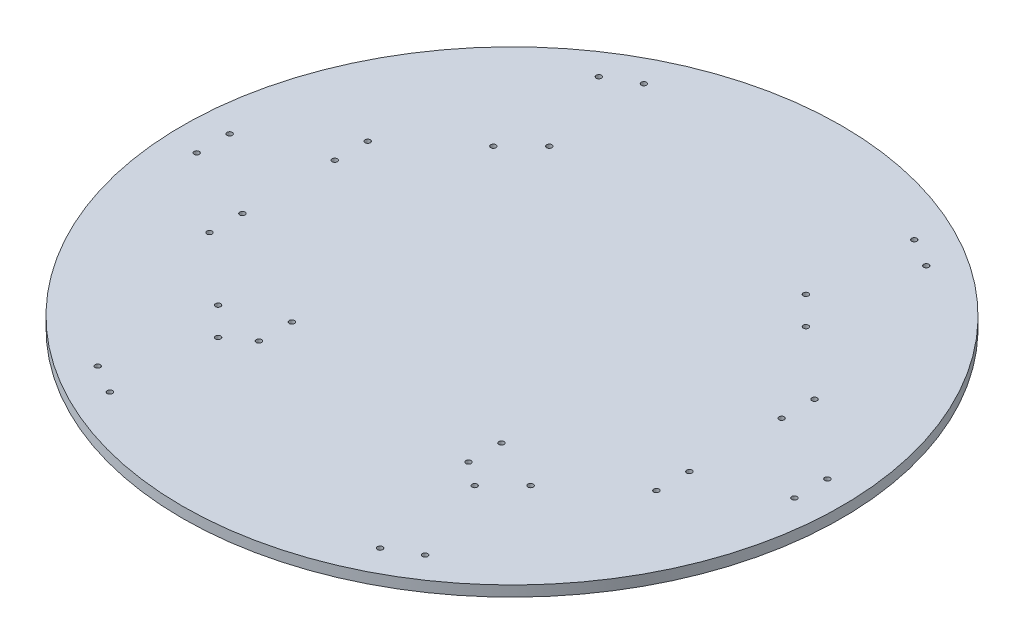
ISO-10303-21;
HEADER;
FILE_DESCRIPTION(('STEP AP214'),'2;1');
FILE_NAME('part.step','',(''),(''),'','','');
FILE_SCHEMA(('AUTOMOTIVE_DESIGN { 1 0 10303 214 1 1 1 1 }'));
ENDSEC;
DATA;
#1=APPLICATION_CONTEXT('core data for automotive mechanical design processes');
#2=APPLICATION_PROTOCOL_DEFINITION('international standard','automotive_design',2000,#1);
#3=PRODUCT_CONTEXT('',#1,'mechanical');
#4=PRODUCT('Part','Part','',(#3));
#5=PRODUCT_RELATED_PRODUCT_CATEGORY('part','',(#4));
#6=PRODUCT_DEFINITION_FORMATION('','',#4);
#7=PRODUCT_DEFINITION_CONTEXT('part definition',#1,'design');
#8=PRODUCT_DEFINITION('design','',#6,#7);
#9=PRODUCT_DEFINITION_SHAPE('','',#8);
#10=(LENGTH_UNIT() NAMED_UNIT(*) SI_UNIT(.MILLI.,.METRE.));
#11=(NAMED_UNIT(*) PLANE_ANGLE_UNIT() SI_UNIT($,.RADIAN.));
#12=(NAMED_UNIT(*) SI_UNIT($,.STERADIAN.) SOLID_ANGLE_UNIT());
#13=UNCERTAINTY_MEASURE_WITH_UNIT(LENGTH_MEASURE(1.E-05),#10,'distance_accuracy_value','');
#14=(GEOMETRIC_REPRESENTATION_CONTEXT(3) GLOBAL_UNCERTAINTY_ASSIGNED_CONTEXT((#13)) GLOBAL_UNIT_ASSIGNED_CONTEXT((#10,
#11,#12)) REPRESENTATION_CONTEXT('',''));
#15=CARTESIAN_POINT('',(0.,0.,0.));
#16=DIRECTION('',(0.,0.,1.));
#17=DIRECTION('',(1.,0.,0.));
#18=AXIS2_PLACEMENT_3D('',#15,#16,#17);
#19=CARTESIAN_POINT('',(0.,8.,0.));
#20=DIRECTION('',(0.,-1.,0.));
#21=DIRECTION('',(0.,0.,-1.));
#22=AXIS2_PLACEMENT_3D('',#19,#20,#21);
#23=CYLINDRICAL_SURFACE('',#22,250.);
#24=CARTESIAN_POINT('',(0.,8.,0.));
#25=DIRECTION('',(0.,1.,0.));
#26=DIRECTION('',(0.,0.,1.));
#27=AXIS2_PLACEMENT_3D('',#24,#25,#26);
#28=CIRCLE('',#27,250.);
#29=CARTESIAN_POINT('',(0.,8.,250.));
#30=VERTEX_POINT('',#29);
#31=EDGE_CURVE('E10',#30,#30,#28,.T.);
#32=ORIENTED_EDGE('',*,*,#31,.F.);
#33=EDGE_LOOP('',(#32));
#34=FACE_BOUND('',#33,.T.);
#35=CARTESIAN_POINT('',(0.,0.,0.));
#36=DIRECTION('',(0.,1.,0.));
#37=DIRECTION('',(0.,0.,1.));
#38=AXIS2_PLACEMENT_3D('',#35,#36,#37);
#39=CIRCLE('',#38,250.);
#40=CARTESIAN_POINT('',(0.,0.,250.));
#41=VERTEX_POINT('',#40);
#42=EDGE_CURVE('E38',#41,#41,#39,.T.);
#43=ORIENTED_EDGE('',*,*,#42,.T.);
#44=EDGE_LOOP('',(#43));
#45=FACE_BOUND('',#44,.T.);
#46=ADVANCED_FACE('F35',(#34,#45),#23,.T.);
#47=CARTESIAN_POINT('',(0.,8.,0.));
#48=DIRECTION('',(0.,1.,0.));
#49=DIRECTION('',(0.,0.,1.));
#50=AXIS2_PLACEMENT_3D('',#47,#48,#49);
#51=PLANE('',#50);
#52=CARTESIAN_POINT('',(79.5,8.,87.5));
#53=DIRECTION('',(0.,1.,0.));
#54=DIRECTION('',(0.,0.,-1.));
#55=AXIS2_PLACEMENT_3D('',#52,#53,#54);
#56=CIRCLE('',#55,2.);
#57=CARTESIAN_POINT('',(79.5,8.,85.5));
#58=VERTEX_POINT('',#57);
#59=EDGE_CURVE('E230',#58,#58,#56,.T.);
#60=ORIENTED_EDGE('',*,*,#59,.F.);
#61=EDGE_LOOP('',(#60));
#62=FACE_BOUND('',#61,.T.);
#63=CARTESIAN_POINT('',(79.5,8.,112.5));
#64=DIRECTION('',(0.,1.,0.));
#65=DIRECTION('',(0.,0.,-1.));
#66=AXIS2_PLACEMENT_3D('',#63,#64,#65);
#67=CIRCLE('',#66,2.);
#68=CARTESIAN_POINT('',(79.5,8.,110.5));
#69=VERTEX_POINT('',#68);
#70=EDGE_CURVE('E224',#69,#69,#67,.T.);
#71=ORIENTED_EDGE('',*,*,#70,.F.);
#72=EDGE_LOOP('',(#71));
#73=FACE_BOUND('',#72,.T.);
#74=CARTESIAN_POINT('',(-169.500000000015,8.,-35.000000000001));
#75=DIRECTION('',(0.,1.,0.));
#76=DIRECTION('',(0.,0.,-1.));
#77=AXIS2_PLACEMENT_3D('',#74,#75,#76);
#78=CIRCLE('',#77,2.);
#79=CARTESIAN_POINT('',(-169.500000000015,8.,-37.000000000001));
#80=VERTEX_POINT('',#79);
#81=EDGE_CURVE('E221',#80,#80,#78,.T.);
#82=ORIENTED_EDGE('',*,*,#81,.F.);
#83=EDGE_LOOP('',(#82));
#84=FACE_BOUND('',#83,.T.);
#85=CARTESIAN_POINT('',(-169.500000000015,8.,-60.000000000001));
#86=DIRECTION('',(0.,1.,0.));
#87=DIRECTION('',(0.,0.,-1.));
#88=AXIS2_PLACEMENT_3D('',#85,#86,#87);
#89=CIRCLE('',#88,2.);
#90=CARTESIAN_POINT('',(-169.500000000015,8.,-62.000000000001));
#91=VERTEX_POINT('',#90);
#92=EDGE_CURVE('E215',#91,#91,#89,.T.);
#93=ORIENTED_EDGE('',*,*,#92,.F.);
#94=EDGE_LOOP('',(#93));
#95=FACE_BOUND('',#94,.T.);
#96=CARTESIAN_POINT('',(-169.500000000015,8.,35.000000000001));
#97=DIRECTION('',(0.,-1.,0.));
#98=DIRECTION('',(0.,0.,1.));
#99=AXIS2_PLACEMENT_3D('',#96,#97,#98);
#100=CIRCLE('',#99,2.);
#101=CARTESIAN_POINT('',(-169.500000000015,8.,37.000000000001));
#102=VERTEX_POINT('',#101);
#103=EDGE_CURVE('E209',#102,#102,#100,.T.);
#104=ORIENTED_EDGE('',*,*,#103,.T.);
#105=EDGE_LOOP('',(#104));
#106=FACE_BOUND('',#105,.T.);
#107=CARTESIAN_POINT('',(-169.500000000015,8.,60.000000000001));
#108=DIRECTION('',(0.,-1.,0.));
#109=DIRECTION('',(0.,0.,1.));
#110=AXIS2_PLACEMENT_3D('',#107,#108,#109);
#111=CIRCLE('',#110,2.);
#112=CARTESIAN_POINT('',(-169.500000000015,8.,62.000000000001));
#113=VERTEX_POINT('',#112);
#114=EDGE_CURVE('E203',#113,#113,#111,.T.);
#115=ORIENTED_EDGE('',*,*,#114,.T.);
#116=EDGE_LOOP('',(#115));
#117=FACE_BOUND('',#116,.T.);
#118=CARTESIAN_POINT('',(169.500000000015,8.,-35.000000000001));
#119=DIRECTION('',(0.,-1.,0.));
#120=DIRECTION('',(0.,0.,-1.));
#121=AXIS2_PLACEMENT_3D('',#118,#119,#120);
#122=CIRCLE('',#121,2.);
#123=CARTESIAN_POINT('',(169.500000000015,8.,-37.000000000001));
#124=VERTEX_POINT('',#123);
#125=EDGE_CURVE('E197',#124,#124,#122,.T.);
#126=ORIENTED_EDGE('',*,*,#125,.T.);
#127=EDGE_LOOP('',(#126));
#128=FACE_BOUND('',#127,.T.);
#129=CARTESIAN_POINT('',(169.500000000015,8.,-60.000000000001));
#130=DIRECTION('',(0.,-1.,0.));
#131=DIRECTION('',(0.,0.,-1.));
#132=AXIS2_PLACEMENT_3D('',#129,#130,#131);
#133=CIRCLE('',#132,2.);
#134=CARTESIAN_POINT('',(169.500000000015,8.,-62.000000000001));
#135=VERTEX_POINT('',#134);
#136=EDGE_CURVE('E191',#135,#135,#133,.T.);
#137=ORIENTED_EDGE('',*,*,#136,.T.);
#138=EDGE_LOOP('',(#137));
#139=FACE_BOUND('',#138,.T.);
#140=CARTESIAN_POINT('',(-79.5,8.,87.5));
#141=DIRECTION('',(0.,-1.,0.));
#142=DIRECTION('',(0.,0.,-1.));
#143=AXIS2_PLACEMENT_3D('',#140,#141,#142);
#144=CIRCLE('',#143,2.);
#145=CARTESIAN_POINT('',(-79.5,8.,85.5));
#146=VERTEX_POINT('',#145);
#147=EDGE_CURVE('E182',#146,#146,#144,.T.);
#148=ORIENTED_EDGE('',*,*,#147,.T.);
#149=EDGE_LOOP('',(#148));
#150=FACE_BOUND('',#149,.T.);
#151=CARTESIAN_POINT('',(-79.5,8.,112.5));
#152=DIRECTION('',(0.,-1.,0.));
#153=DIRECTION('',(0.,0.,-1.));
#154=AXIS2_PLACEMENT_3D('',#151,#152,#153);
#155=CIRCLE('',#154,2.);
#156=CARTESIAN_POINT('',(-79.5,8.,110.5));
#157=VERTEX_POINT('',#156);
#158=EDGE_CURVE('E176',#157,#157,#155,.T.);
#159=ORIENTED_EDGE('',*,*,#158,.T.);
#160=EDGE_LOOP('',(#159));
#161=FACE_BOUND('',#160,.T.);
#162=CARTESIAN_POINT('',(169.500000000015,8.,35.000000000001));
#163=DIRECTION('',(0.,1.,0.));
#164=DIRECTION('',(0.,0.,1.));
#165=AXIS2_PLACEMENT_3D('',#162,#163,#164);
#166=CIRCLE('',#165,2.);
#167=CARTESIAN_POINT('',(169.500000000015,8.,37.000000000001));
#168=VERTEX_POINT('',#167);
#169=EDGE_CURVE('E173',#168,#168,#166,.T.);
#170=ORIENTED_EDGE('',*,*,#169,.F.);
#171=EDGE_LOOP('',(#170));
#172=FACE_BOUND('',#171,.T.);
#173=CARTESIAN_POINT('',(169.500000000015,8.,60.000000000001));
#174=DIRECTION('',(0.,1.,0.));
#175=DIRECTION('',(0.,0.,1.));
#176=AXIS2_PLACEMENT_3D('',#173,#174,#175);
#177=CIRCLE('',#176,2.);
#178=CARTESIAN_POINT('',(169.500000000015,8.,62.000000000001));
#179=VERTEX_POINT('',#178);
#180=EDGE_CURVE('E167',#179,#179,#177,.T.);
#181=ORIENTED_EDGE('',*,*,#180,.F.);
#182=EDGE_LOOP('',(#181));
#183=FACE_BOUND('',#182,.T.);
#184=CARTESIAN_POINT('',(118.546938849435,8.,104.417463015163));
#185=DIRECTION('',(0.,1.,0.));
#186=DIRECTION('',(0.,0.,1.));
#187=AXIS2_PLACEMENT_3D('',#184,#185,#186);
#188=CIRCLE('',#187,1.99999999998296);
#189=CARTESIAN_POINT('',(118.546938849435,8.,106.417463015146));
#190=VERTEX_POINT('',#189);
#191=EDGE_CURVE('E160',#190,#190,#188,.F.);
#192=ORIENTED_EDGE('',*,*,#191,.T.);
#193=EDGE_LOOP('',(#192));
#194=FACE_BOUND('',#193,.T.);
#195=CARTESIAN_POINT('',(-118.546938849435,8.,-104.417463015163));
#196=DIRECTION('',(0.,1.,0.));
#197=DIRECTION('',(0.,0.,1.));
#198=AXIS2_PLACEMENT_3D('',#195,#196,#197);
#199=CIRCLE('',#198,1.99999999998296);
#200=CARTESIAN_POINT('',(-118.546938849435,8.,-102.41746301518));
#201=VERTEX_POINT('',#200);
#202=EDGE_CURVE('E154',#201,#201,#199,.F.);
#203=ORIENTED_EDGE('',*,*,#202,.T.);
#204=EDGE_LOOP('',(#203));
#205=FACE_BOUND('',#204,.T.);
#206=CARTESIAN_POINT('',(97.333735413821,8.,125.630666450759));
#207=DIRECTION('',(0.,1.,0.));
#208=DIRECTION('',(0.,0.,1.));
#209=AXIS2_PLACEMENT_3D('',#206,#207,#208);
#210=CIRCLE('',#209,2.00000000002594);
#211=CARTESIAN_POINT('',(97.333735413821,8.,127.630666450785));
#212=VERTEX_POINT('',#211);
#213=EDGE_CURVE('E148',#212,#212,#210,.F.);
#214=ORIENTED_EDGE('',*,*,#213,.T.);
#215=EDGE_LOOP('',(#214));
#216=FACE_BOUND('',#215,.T.);
#217=CARTESIAN_POINT('',(-97.333735413821,8.,-125.630666450759));
#218=DIRECTION('',(0.,1.,0.));
#219=DIRECTION('',(0.,0.,1.));
#220=AXIS2_PLACEMENT_3D('',#217,#218,#219);
#221=CIRCLE('',#220,2.00000000002594);
#222=CARTESIAN_POINT('',(-97.333735413821,8.,-123.630666450733));
#223=VERTEX_POINT('',#222);
#224=EDGE_CURVE('E142',#223,#223,#221,.F.);
#225=ORIENTED_EDGE('',*,*,#224,.T.);
#226=EDGE_LOOP('',(#225));
#227=FACE_BOUND('',#226,.T.);
#228=CARTESIAN_POINT('',(-118.546938849435,8.,104.417463015163));
#229=DIRECTION('',(0.,1.,0.));
#230=DIRECTION('',(0.,0.,1.));
#231=AXIS2_PLACEMENT_3D('',#228,#229,#230);
#232=CIRCLE('',#231,1.99999999998296);
#233=CARTESIAN_POINT('',(-118.546938849435,8.,106.417463015146));
#234=VERTEX_POINT('',#233);
#235=EDGE_CURVE('E136',#234,#234,#232,.T.);
#236=ORIENTED_EDGE('',*,*,#235,.F.);
#237=EDGE_LOOP('',(#236));
#238=FACE_BOUND('',#237,.T.);
#239=CARTESIAN_POINT('',(-97.333735413821,8.,125.630666450759));
#240=DIRECTION('',(0.,1.,0.));
#241=DIRECTION('',(0.,0.,1.));
#242=AXIS2_PLACEMENT_3D('',#239,#240,#241);
#243=CIRCLE('',#242,2.00000000002594);
#244=CARTESIAN_POINT('',(-97.333735413821,8.,127.630666450785));
#245=VERTEX_POINT('',#244);
#246=EDGE_CURVE('E130',#245,#245,#243,.T.);
#247=ORIENTED_EDGE('',*,*,#246,.F.);
#248=EDGE_LOOP('',(#247));
#249=FACE_BOUND('',#248,.T.);
#250=CARTESIAN_POINT('',(118.546938849435,8.,-104.417463015163));
#251=DIRECTION('',(0.,1.,0.));
#252=DIRECTION('',(0.,0.,1.));
#253=AXIS2_PLACEMENT_3D('',#250,#251,#252);
#254=CIRCLE('',#253,1.99999999998296);
#255=CARTESIAN_POINT('',(118.546938849435,8.,-102.41746301518));
#256=VERTEX_POINT('',#255);
#257=EDGE_CURVE('E124',#256,#256,#254,.T.);
#258=ORIENTED_EDGE('',*,*,#257,.F.);
#259=EDGE_LOOP('',(#258));
#260=FACE_BOUND('',#259,.T.);
#261=CARTESIAN_POINT('',(97.333735413821,8.,-125.630666450759));
#262=DIRECTION('',(0.,1.,0.));
#263=DIRECTION('',(0.,0.,1.));
#264=AXIS2_PLACEMENT_3D('',#261,#262,#263);
#265=CIRCLE('',#264,2.00000000002594);
#266=CARTESIAN_POINT('',(97.333735413821,8.,-123.630666450733));
#267=VERTEX_POINT('',#266);
#268=EDGE_CURVE('E111',#267,#267,#265,.T.);
#269=ORIENTED_EDGE('',*,*,#268,.F.);
#270=EDGE_LOOP('',(#269));
#271=FACE_BOUND('',#270,.T.);
#272=CARTESIAN_POINT('',(102.522426187221,8.,-202.574051071495));
#273=DIRECTION('',(0.,1.,0.));
#274=DIRECTION('',(0.,0.,1.));
#275=AXIS2_PLACEMENT_3D('',#272,#273,#274);
#276=CIRCLE('',#275,2.);
#277=CARTESIAN_POINT('',(102.522426187221,8.,-200.574051071495));
#278=VERTEX_POINT('',#277);
#279=EDGE_CURVE('E94',#278,#278,#276,.T.);
#280=ORIENTED_EDGE('',*,*,#279,.F.);
#281=EDGE_LOOP('',(#280));
#282=FACE_BOUND('',#281,.T.);
#283=CARTESIAN_POINT('',(226.695487469051,8.,-12.5000000000001));
#284=DIRECTION('',(0.,1.,0.));
#285=DIRECTION('',(0.,0.,1.));
#286=AXIS2_PLACEMENT_3D('',#283,#284,#285);
#287=CIRCLE('',#286,2.);
#288=CARTESIAN_POINT('',(226.695487469051,8.,-10.5000000000001));
#289=VERTEX_POINT('',#288);
#290=EDGE_CURVE('E97',#289,#289,#287,.T.);
#291=ORIENTED_EDGE('',*,*,#290,.F.);
#292=EDGE_LOOP('',(#291));
#293=FACE_BOUND('',#292,.T.);
#294=CARTESIAN_POINT('',(124.173061281829,8.,190.074051071496));
#295=DIRECTION('',(0.,1.,0.));
#296=DIRECTION('',(0.,0.,1.));
#297=AXIS2_PLACEMENT_3D('',#294,#295,#296);
#298=CIRCLE('',#297,2.);
#299=CARTESIAN_POINT('',(124.173061281829,8.,192.074051071497));
#300=VERTEX_POINT('',#299);
#301=EDGE_CURVE('E100',#300,#300,#298,.T.);
#302=ORIENTED_EDGE('',*,*,#301,.F.);
#303=EDGE_LOOP('',(#302));
#304=FACE_BOUND('',#303,.T.);
#305=CARTESIAN_POINT('',(-102.522426187223,8.,202.574051071494));
#306=DIRECTION('',(0.,1.,0.));
#307=DIRECTION('',(0.,0.,1.));
#308=AXIS2_PLACEMENT_3D('',#305,#306,#307);
#309=CIRCLE('',#308,2.);
#310=CARTESIAN_POINT('',(-102.522426187223,8.,204.574051071494));
#311=VERTEX_POINT('',#310);
#312=EDGE_CURVE('E103',#311,#311,#309,.T.);
#313=ORIENTED_EDGE('',*,*,#312,.F.);
#314=EDGE_LOOP('',(#313));
#315=FACE_BOUND('',#314,.T.);
#316=CARTESIAN_POINT('',(-124.173061281831,8.,-190.074051071496));
#317=DIRECTION('',(0.,1.,0.));
#318=DIRECTION('',(0.,0.,1.));
#319=AXIS2_PLACEMENT_3D('',#316,#317,#318);
#320=CIRCLE('',#319,2.);
#321=CARTESIAN_POINT('',(-124.173061281831,8.,-188.074051071496));
#322=VERTEX_POINT('',#321);
#323=EDGE_CURVE('E81',#322,#322,#320,.T.);
#324=ORIENTED_EDGE('',*,*,#323,.F.);
#325=EDGE_LOOP('',(#324));
#326=FACE_BOUND('',#325,.T.);
#327=CARTESIAN_POINT('',(124.173061281832,8.,-190.074051071495));
#328=DIRECTION('',(0.,1.,0.));
#329=DIRECTION('',(0.,0.,1.));
#330=AXIS2_PLACEMENT_3D('',#327,#328,#329);
#331=CIRCLE('',#330,2.);
#332=CARTESIAN_POINT('',(124.173061281832,8.,-188.074051071495));
#333=VERTEX_POINT('',#332);
#334=EDGE_CURVE('E64',#333,#333,#331,.T.);
#335=ORIENTED_EDGE('',*,*,#334,.F.);
#336=EDGE_LOOP('',(#335));
#337=FACE_BOUND('',#336,.T.);
#338=CARTESIAN_POINT('',(226.695487469051,8.,12.4999999999999));
#339=DIRECTION('',(0.,1.,0.));
#340=DIRECTION('',(0.,0.,1.));
#341=AXIS2_PLACEMENT_3D('',#338,#339,#340);
#342=CIRCLE('',#341,2.);
#343=CARTESIAN_POINT('',(226.695487469051,8.,14.4999999999999));
#344=VERTEX_POINT('',#343);
#345=EDGE_CURVE('E67',#344,#344,#342,.T.);
#346=ORIENTED_EDGE('',*,*,#345,.F.);
#347=EDGE_LOOP('',(#346));
#348=FACE_BOUND('',#347,.T.);
#349=CARTESIAN_POINT('',(102.522426187218,8.,202.574051071496));
#350=DIRECTION('',(0.,1.,0.));
#351=DIRECTION('',(0.,0.,1.));
#352=AXIS2_PLACEMENT_3D('',#349,#350,#351);
#353=CIRCLE('',#352,2.);
#354=CARTESIAN_POINT('',(102.522426187218,8.,204.574051071496));
#355=VERTEX_POINT('',#354);
#356=EDGE_CURVE('E70',#355,#355,#353,.T.);
#357=ORIENTED_EDGE('',*,*,#356,.F.);
#358=EDGE_LOOP('',(#357));
#359=FACE_BOUND('',#358,.T.);
#360=CARTESIAN_POINT('',(-124.173061281833,8.,190.074051071494));
#361=DIRECTION('',(0.,1.,0.));
#362=DIRECTION('',(0.,0.,1.));
#363=AXIS2_PLACEMENT_3D('',#360,#361,#362);
#364=CIRCLE('',#363,2.);
#365=CARTESIAN_POINT('',(-124.173061281833,8.,192.074051071494));
#366=VERTEX_POINT('',#365);
#367=EDGE_CURVE('E73',#366,#366,#364,.T.);
#368=ORIENTED_EDGE('',*,*,#367,.F.);
#369=EDGE_LOOP('',(#368));
#370=FACE_BOUND('',#369,.T.);
#371=CARTESIAN_POINT('',(-102.52242618722,8.,-202.574051071496));
#372=DIRECTION('',(0.,1.,0.));
#373=DIRECTION('',(0.,0.,1.));
#374=AXIS2_PLACEMENT_3D('',#371,#372,#373);
#375=CIRCLE('',#374,2.);
#376=CARTESIAN_POINT('',(-102.52242618722,8.,-200.574051071496));
#377=VERTEX_POINT('',#376);
#378=EDGE_CURVE('E58',#377,#377,#375,.T.);
#379=ORIENTED_EDGE('',*,*,#378,.F.);
#380=EDGE_LOOP('',(#379));
#381=FACE_BOUND('',#380,.T.);
#382=CARTESIAN_POINT('',(-226.695487469051,8.,12.5000000000001));
#383=DIRECTION('',(0.,1.,0.));
#384=DIRECTION('',(0.,0.,1.));
#385=AXIS2_PLACEMENT_3D('',#382,#383,#384);
#386=CIRCLE('',#385,2.);
#387=CARTESIAN_POINT('',(-226.695487469051,8.,14.5000000000001));
#388=VERTEX_POINT('',#387);
#389=EDGE_CURVE('E52',#388,#388,#386,.T.);
#390=ORIENTED_EDGE('',*,*,#389,.F.);
#391=EDGE_LOOP('',(#390));
#392=FACE_BOUND('',#391,.T.);
#393=CARTESIAN_POINT('',(-226.695487469051,8.,-12.4999999999999));
#394=DIRECTION('',(0.,1.,0.));
#395=DIRECTION('',(0.,0.,1.));
#396=AXIS2_PLACEMENT_3D('',#393,#394,#395);
#397=CIRCLE('',#396,2.);
#398=CARTESIAN_POINT('',(-226.695487469051,8.,-10.4999999999999));
#399=VERTEX_POINT('',#398);
#400=EDGE_CURVE('E45',#399,#399,#397,.T.);
#401=ORIENTED_EDGE('',*,*,#400,.F.);
#402=EDGE_LOOP('',(#401));
#403=FACE_BOUND('',#402,.T.);
#404=ORIENTED_EDGE('',*,*,#31,.T.);
#405=EDGE_LOOP('',(#404));
#406=FACE_BOUND('',#405,.T.);
#407=ADVANCED_FACE('F242',(#62,#73,#84,#95,#106,#117,#128,#139,#150,#161,#172,#183,#194,#205,
#216,#227,#238,#249,#260,#271,#282,#293,#304,#315,#326,#337,#348,#359,#370,#381,#392,#403,#406),
#51,.T.);
#408=CARTESIAN_POINT('',(0.,0.,0.));
#409=DIRECTION('',(0.,1.,0.));
#410=DIRECTION('',(0.,0.,1.));
#411=AXIS2_PLACEMENT_3D('',#408,#409,#410);
#412=PLANE('',#411);
#413=CARTESIAN_POINT('',(79.5,0.,87.5));
#414=DIRECTION('',(0.,1.,0.));
#415=DIRECTION('',(0.,0.,-1.));
#416=AXIS2_PLACEMENT_3D('',#413,#414,#415);
#417=CIRCLE('',#416,2.);
#418=CARTESIAN_POINT('',(79.5,0.,85.5));
#419=VERTEX_POINT('',#418);
#420=EDGE_CURVE('E233',#419,#419,#417,.T.);
#421=ORIENTED_EDGE('',*,*,#420,.T.);
#422=EDGE_LOOP('',(#421));
#423=FACE_BOUND('',#422,.T.);
#424=CARTESIAN_POINT('',(79.5,0.,112.5));
#425=DIRECTION('',(0.,1.,0.));
#426=DIRECTION('',(0.,0.,-1.));
#427=AXIS2_PLACEMENT_3D('',#424,#425,#426);
#428=CIRCLE('',#427,2.);
#429=CARTESIAN_POINT('',(79.5,0.,110.5));
#430=VERTEX_POINT('',#429);
#431=EDGE_CURVE('E227',#430,#430,#428,.T.);
#432=ORIENTED_EDGE('',*,*,#431,.T.);
#433=EDGE_LOOP('',(#432));
#434=FACE_BOUND('',#433,.T.);
#435=CARTESIAN_POINT('',(-169.500000000015,0.,-35.000000000001));
#436=DIRECTION('',(0.,1.,0.));
#437=DIRECTION('',(0.,0.,-1.));
#438=AXIS2_PLACEMENT_3D('',#435,#436,#437);
#439=CIRCLE('',#438,2.);
#440=CARTESIAN_POINT('',(-169.500000000015,0.,-37.000000000001));
#441=VERTEX_POINT('',#440);
#442=EDGE_CURVE('E218',#441,#441,#439,.T.);
#443=ORIENTED_EDGE('',*,*,#442,.T.);
#444=EDGE_LOOP('',(#443));
#445=FACE_BOUND('',#444,.T.);
#446=CARTESIAN_POINT('',(-169.500000000015,0.,-60.000000000001));
#447=DIRECTION('',(0.,1.,0.));
#448=DIRECTION('',(0.,0.,-1.));
#449=AXIS2_PLACEMENT_3D('',#446,#447,#448);
#450=CIRCLE('',#449,2.);
#451=CARTESIAN_POINT('',(-169.500000000015,0.,-62.000000000001));
#452=VERTEX_POINT('',#451);
#453=EDGE_CURVE('E212',#452,#452,#450,.T.);
#454=ORIENTED_EDGE('',*,*,#453,.T.);
#455=EDGE_LOOP('',(#454));
#456=FACE_BOUND('',#455,.T.);
#457=CARTESIAN_POINT('',(-169.500000000015,0.,35.000000000001));
#458=DIRECTION('',(0.,-1.,0.));
#459=DIRECTION('',(0.,0.,1.));
#460=AXIS2_PLACEMENT_3D('',#457,#458,#459);
#461=CIRCLE('',#460,2.);
#462=CARTESIAN_POINT('',(-169.500000000015,0.,37.000000000001));
#463=VERTEX_POINT('',#462);
#464=EDGE_CURVE('E206',#463,#463,#461,.T.);
#465=ORIENTED_EDGE('',*,*,#464,.F.);
#466=EDGE_LOOP('',(#465));
#467=FACE_BOUND('',#466,.T.);
#468=CARTESIAN_POINT('',(-169.500000000015,0.,60.000000000001));
#469=DIRECTION('',(0.,-1.,0.));
#470=DIRECTION('',(0.,0.,1.));
#471=AXIS2_PLACEMENT_3D('',#468,#469,#470);
#472=CIRCLE('',#471,2.);
#473=CARTESIAN_POINT('',(-169.500000000015,0.,62.000000000001));
#474=VERTEX_POINT('',#473);
#475=EDGE_CURVE('E200',#474,#474,#472,.T.);
#476=ORIENTED_EDGE('',*,*,#475,.F.);
#477=EDGE_LOOP('',(#476));
#478=FACE_BOUND('',#477,.T.);
#479=CARTESIAN_POINT('',(169.500000000015,0.,-35.000000000001));
#480=DIRECTION('',(0.,-1.,0.));
#481=DIRECTION('',(0.,0.,-1.));
#482=AXIS2_PLACEMENT_3D('',#479,#480,#481);
#483=CIRCLE('',#482,2.);
#484=CARTESIAN_POINT('',(169.500000000015,0.,-37.000000000001));
#485=VERTEX_POINT('',#484);
#486=EDGE_CURVE('E194',#485,#485,#483,.T.);
#487=ORIENTED_EDGE('',*,*,#486,.F.);
#488=EDGE_LOOP('',(#487));
#489=FACE_BOUND('',#488,.T.);
#490=CARTESIAN_POINT('',(169.500000000015,0.,-60.000000000001));
#491=DIRECTION('',(0.,-1.,0.));
#492=DIRECTION('',(0.,0.,-1.));
#493=AXIS2_PLACEMENT_3D('',#490,#491,#492);
#494=CIRCLE('',#493,2.);
#495=CARTESIAN_POINT('',(169.500000000015,0.,-62.000000000001));
#496=VERTEX_POINT('',#495);
#497=EDGE_CURVE('E188',#496,#496,#494,.T.);
#498=ORIENTED_EDGE('',*,*,#497,.F.);
#499=EDGE_LOOP('',(#498));
#500=FACE_BOUND('',#499,.T.);
#501=CARTESIAN_POINT('',(-79.5,0.,87.5));
#502=DIRECTION('',(0.,-1.,0.));
#503=DIRECTION('',(0.,0.,-1.));
#504=AXIS2_PLACEMENT_3D('',#501,#502,#503);
#505=CIRCLE('',#504,2.);
#506=CARTESIAN_POINT('',(-79.5,0.,85.5));
#507=VERTEX_POINT('',#506);
#508=EDGE_CURVE('E185',#507,#507,#505,.T.);
#509=ORIENTED_EDGE('',*,*,#508,.F.);
#510=EDGE_LOOP('',(#509));
#511=FACE_BOUND('',#510,.T.);
#512=CARTESIAN_POINT('',(-79.5,0.,112.5));
#513=DIRECTION('',(0.,-1.,0.));
#514=DIRECTION('',(0.,0.,-1.));
#515=AXIS2_PLACEMENT_3D('',#512,#513,#514);
#516=CIRCLE('',#515,2.);
#517=CARTESIAN_POINT('',(-79.5,0.,110.5));
#518=VERTEX_POINT('',#517);
#519=EDGE_CURVE('E179',#518,#518,#516,.T.);
#520=ORIENTED_EDGE('',*,*,#519,.F.);
#521=EDGE_LOOP('',(#520));
#522=FACE_BOUND('',#521,.T.);
#523=CARTESIAN_POINT('',(169.500000000015,0.,35.000000000001));
#524=DIRECTION('',(0.,1.,0.));
#525=DIRECTION('',(0.,0.,1.));
#526=AXIS2_PLACEMENT_3D('',#523,#524,#525);
#527=CIRCLE('',#526,2.);
#528=CARTESIAN_POINT('',(169.500000000015,0.,37.000000000001));
#529=VERTEX_POINT('',#528);
#530=EDGE_CURVE('E170',#529,#529,#527,.T.);
#531=ORIENTED_EDGE('',*,*,#530,.T.);
#532=EDGE_LOOP('',(#531));
#533=FACE_BOUND('',#532,.T.);
#534=CARTESIAN_POINT('',(169.500000000015,0.,60.000000000001));
#535=DIRECTION('',(0.,1.,0.));
#536=DIRECTION('',(0.,0.,1.));
#537=AXIS2_PLACEMENT_3D('',#534,#535,#536);
#538=CIRCLE('',#537,2.);
#539=CARTESIAN_POINT('',(169.500000000015,0.,62.000000000001));
#540=VERTEX_POINT('',#539);
#541=EDGE_CURVE('E166',#540,#540,#538,.T.);
#542=ORIENTED_EDGE('',*,*,#541,.T.);
#543=EDGE_LOOP('',(#542));
#544=FACE_BOUND('',#543,.T.);
#545=CARTESIAN_POINT('',(118.546938849435,2.03309591384482E-12,104.417463015163));
#546=DIRECTION('',(0.,-1.,0.));
#547=DIRECTION('',(0.,0.,-1.));
#548=AXIS2_PLACEMENT_3D('',#545,#546,#547);
#549=CIRCLE('',#548,1.99999999998296);
#550=CARTESIAN_POINT('',(118.546938849435,2.03242978003005E-12,102.41746301518));
#551=VERTEX_POINT('',#550);
#552=EDGE_CURVE('E163',#551,#551,#549,.T.);
#553=ORIENTED_EDGE('',*,*,#552,.F.);
#554=EDGE_LOOP('',(#553));
#555=FACE_BOUND('',#554,.T.);
#556=CARTESIAN_POINT('',(-118.546938849435,2.03309591384482E-12,-104.417463015163));
#557=DIRECTION('',(0.,-1.,0.));
#558=DIRECTION('',(0.,0.,1.));
#559=AXIS2_PLACEMENT_3D('',#556,#557,#558);
#560=CIRCLE('',#559,1.99999999998296);
#561=CARTESIAN_POINT('',(-118.546938849435,2.03242978003005E-12,-102.41746301518));
#562=VERTEX_POINT('',#561);
#563=EDGE_CURVE('E157',#562,#562,#560,.T.);
#564=ORIENTED_EDGE('',*,*,#563,.F.);
#565=EDGE_LOOP('',(#564));
#566=FACE_BOUND('',#565,.T.);
#567=CARTESIAN_POINT('',(97.333735413821,2.04523897817666E-12,125.630666450759));
#568=DIRECTION('',(0.,-1.,0.));
#569=DIRECTION('',(0.,0.,-1.));
#570=AXIS2_PLACEMENT_3D('',#567,#568,#569);
#571=CIRCLE('',#570,2.00000000002594);
#572=CARTESIAN_POINT('',(97.333735413821,2.04457284436187E-12,123.630666450733));
#573=VERTEX_POINT('',#572);
#574=EDGE_CURVE('E151',#573,#573,#571,.T.);
#575=ORIENTED_EDGE('',*,*,#574,.F.);
#576=EDGE_LOOP('',(#575));
#577=FACE_BOUND('',#576,.T.);
#578=CARTESIAN_POINT('',(-97.333735413821,2.04523897817666E-12,-125.630666450759));
#579=DIRECTION('',(0.,-1.,0.));
#580=DIRECTION('',(0.,0.,1.));
#581=AXIS2_PLACEMENT_3D('',#578,#579,#580);
#582=CIRCLE('',#581,2.00000000002594);
#583=CARTESIAN_POINT('',(-97.333735413821,2.04457284436187E-12,-123.630666450733));
#584=VERTEX_POINT('',#583);
#585=EDGE_CURVE('E145',#584,#584,#582,.T.);
#586=ORIENTED_EDGE('',*,*,#585,.F.);
#587=EDGE_LOOP('',(#586));
#588=FACE_BOUND('',#587,.T.);
#589=CARTESIAN_POINT('',(-118.546938849435,2.03309591384482E-12,104.417463015163));
#590=DIRECTION('',(0.,1.,0.));
#591=DIRECTION('',(0.,0.,-1.));
#592=AXIS2_PLACEMENT_3D('',#589,#590,#591);
#593=CIRCLE('',#592,1.99999999998296);
#594=CARTESIAN_POINT('',(-118.546938849435,2.03242978003005E-12,102.41746301518));
#595=VERTEX_POINT('',#594);
#596=EDGE_CURVE('E139',#595,#595,#593,.T.);
#597=ORIENTED_EDGE('',*,*,#596,.T.);
#598=EDGE_LOOP('',(#597));
#599=FACE_BOUND('',#598,.T.);
#600=CARTESIAN_POINT('',(-97.333735413821,2.04523897817666E-12,125.630666450759));
#601=DIRECTION('',(0.,1.,0.));
#602=DIRECTION('',(0.,0.,-1.));
#603=AXIS2_PLACEMENT_3D('',#600,#601,#602);
#604=CIRCLE('',#603,2.00000000002594);
#605=CARTESIAN_POINT('',(-97.333735413821,2.04457284436187E-12,123.630666450733));
#606=VERTEX_POINT('',#605);
#607=EDGE_CURVE('E133',#606,#606,#604,.T.);
#608=ORIENTED_EDGE('',*,*,#607,.T.);
#609=EDGE_LOOP('',(#608));
#610=FACE_BOUND('',#609,.T.);
#611=CARTESIAN_POINT('',(118.546938849435,2.03309591384482E-12,-104.417463015163));
#612=DIRECTION('',(0.,1.,0.));
#613=DIRECTION('',(0.,0.,1.));
#614=AXIS2_PLACEMENT_3D('',#611,#612,#613);
#615=CIRCLE('',#614,1.99999999998296);
#616=CARTESIAN_POINT('',(118.546938849435,2.03242978003005E-12,-102.41746301518));
#617=VERTEX_POINT('',#616);
#618=EDGE_CURVE('E127',#617,#617,#615,.T.);
#619=ORIENTED_EDGE('',*,*,#618,.T.);
#620=EDGE_LOOP('',(#619));
#621=FACE_BOUND('',#620,.T.);
#622=CARTESIAN_POINT('',(97.333735413821,2.04523897817666E-12,-125.630666450759));
#623=DIRECTION('',(0.,1.,0.));
#624=DIRECTION('',(0.,0.,1.));
#625=AXIS2_PLACEMENT_3D('',#622,#623,#624);
#626=CIRCLE('',#625,2.00000000002594);
#627=CARTESIAN_POINT('',(97.333735413821,2.04457284436187E-12,-123.630666450733));
#628=VERTEX_POINT('',#627);
#629=EDGE_CURVE('E121',#628,#628,#626,.T.);
#630=ORIENTED_EDGE('',*,*,#629,.T.);
#631=EDGE_LOOP('',(#630));
#632=FACE_BOUND('',#631,.T.);
#633=CARTESIAN_POINT('',(102.522426187221,-1.71737624121704E-13,-202.574051071495));
#634=DIRECTION('',(0.,1.,0.));
#635=DIRECTION('',(-0.866025403784436,0.,-0.500000000000004));
#636=AXIS2_PLACEMENT_3D('',#633,#634,#635);
#637=CIRCLE('',#636,2.);
#638=CARTESIAN_POINT('',(100.790375379652,-1.71737624121704E-13,-203.574051071495));
#639=VERTEX_POINT('',#638);
#640=EDGE_CURVE('E106',#639,#639,#637,.T.);
#641=ORIENTED_EDGE('',*,*,#640,.T.);
#642=EDGE_LOOP('',(#641));
#643=FACE_BOUND('',#642,.T.);
#644=CARTESIAN_POINT('',(226.695487469051,-1.71737624121704E-13,-12.5000000000001));
#645=DIRECTION('',(0.,1.,0.));
#646=DIRECTION('',(0.,0.,-1.));
#647=AXIS2_PLACEMENT_3D('',#644,#645,#646);
#648=CIRCLE('',#647,2.);
#649=CARTESIAN_POINT('',(226.695487469051,-1.71737624121704E-13,-14.5000000000001));
#650=VERTEX_POINT('',#649);
#651=EDGE_CURVE('E114',#650,#650,#648,.T.);
#652=ORIENTED_EDGE('',*,*,#651,.T.);
#653=EDGE_LOOP('',(#652));
#654=FACE_BOUND('',#653,.T.);
#655=CARTESIAN_POINT('',(124.173061281829,-1.71737624121704E-13,190.074051071496));
#656=DIRECTION('',(0.,1.,0.));
#657=DIRECTION('',(0.866025403784443,0.,-0.499999999999992));
#658=AXIS2_PLACEMENT_3D('',#655,#656,#657);
#659=CIRCLE('',#658,2.);
#660=CARTESIAN_POINT('',(125.905112089398,-1.71737624121704E-13,189.074051071497));
#661=VERTEX_POINT('',#660);
#662=EDGE_CURVE('E110',#661,#661,#659,.T.);
#663=ORIENTED_EDGE('',*,*,#662,.T.);
#664=EDGE_LOOP('',(#663));
#665=FACE_BOUND('',#664,.T.);
#666=CARTESIAN_POINT('',(-102.522426187223,-1.71737624121704E-13,202.574051071494));
#667=DIRECTION('',(0.,1.,0.));
#668=DIRECTION('',(0.866025403784433,0.,0.50000000000001));
#669=AXIS2_PLACEMENT_3D('',#666,#667,#668);
#670=CIRCLE('',#669,2.);
#671=CARTESIAN_POINT('',(-100.790375379654,-1.71737624121704E-13,203.574051071494));
#672=VERTEX_POINT('',#671);
#673=EDGE_CURVE('E107',#672,#672,#670,.T.);
#674=ORIENTED_EDGE('',*,*,#673,.T.);
#675=EDGE_LOOP('',(#674));
#676=FACE_BOUND('',#675,.T.);
#677=CARTESIAN_POINT('',(-124.173061281831,-1.71737624121704E-13,-190.074051071496));
#678=DIRECTION('',(0.,1.,0.));
#679=DIRECTION('',(-0.86602540378444,0.,0.499999999999998));
#680=AXIS2_PLACEMENT_3D('',#677,#678,#679);
#681=CIRCLE('',#680,2.);
#682=CARTESIAN_POINT('',(-125.9051120894,-1.71737624121704E-13,-189.074051071496));
#683=VERTEX_POINT('',#682);
#684=EDGE_CURVE('E91',#683,#683,#681,.T.);
#685=ORIENTED_EDGE('',*,*,#684,.T.);
#686=EDGE_LOOP('',(#685));
#687=FACE_BOUND('',#686,.T.);
#688=CARTESIAN_POINT('',(124.173061281832,-1.71737624121704E-13,-190.074051071495));
#689=DIRECTION('',(0.,1.,0.));
#690=DIRECTION('',(-0.866025403784436,0.,-0.500000000000004));
#691=AXIS2_PLACEMENT_3D('',#688,#689,#690);
#692=CIRCLE('',#691,2.);
#693=CARTESIAN_POINT('',(122.441010474263,-1.71737624121704E-13,-191.074051071495));
#694=VERTEX_POINT('',#693);
#695=EDGE_CURVE('E76',#694,#694,#692,.T.);
#696=ORIENTED_EDGE('',*,*,#695,.T.);
#697=EDGE_LOOP('',(#696));
#698=FACE_BOUND('',#697,.T.);
#699=CARTESIAN_POINT('',(226.695487469051,-1.71737624121704E-13,12.4999999999999));
#700=DIRECTION('',(0.,1.,0.));
#701=DIRECTION('',(0.,0.,-1.));
#702=AXIS2_PLACEMENT_3D('',#699,#700,#701);
#703=CIRCLE('',#702,2.);
#704=CARTESIAN_POINT('',(226.695487469051,-1.71737624121704E-13,10.4999999999999));
#705=VERTEX_POINT('',#704);
#706=EDGE_CURVE('E84',#705,#705,#703,.T.);
#707=ORIENTED_EDGE('',*,*,#706,.T.);
#708=EDGE_LOOP('',(#707));
#709=FACE_BOUND('',#708,.T.);
#710=CARTESIAN_POINT('',(102.522426187218,-1.71737624121704E-13,202.574051071496));
#711=DIRECTION('',(0.,1.,0.));
#712=DIRECTION('',(0.866025403784443,0.,-0.499999999999992));
#713=AXIS2_PLACEMENT_3D('',#710,#711,#712);
#714=CIRCLE('',#713,2.);
#715=CARTESIAN_POINT('',(104.254476994787,-1.71737624121704E-13,201.574051071496));
#716=VERTEX_POINT('',#715);
#717=EDGE_CURVE('E80',#716,#716,#714,.T.);
#718=ORIENTED_EDGE('',*,*,#717,.T.);
#719=EDGE_LOOP('',(#718));
#720=FACE_BOUND('',#719,.T.);
#721=CARTESIAN_POINT('',(-124.173061281833,-1.71737624121704E-13,190.074051071494));
#722=DIRECTION('',(0.,1.,0.));
#723=DIRECTION('',(0.866025403784433,0.,0.50000000000001));
#724=AXIS2_PLACEMENT_3D('',#721,#722,#723);
#725=CIRCLE('',#724,2.);
#726=CARTESIAN_POINT('',(-122.441010474264,-1.71737624121704E-13,191.074051071494));
#727=VERTEX_POINT('',#726);
#728=EDGE_CURVE('E77',#727,#727,#725,.T.);
#729=ORIENTED_EDGE('',*,*,#728,.T.);
#730=EDGE_LOOP('',(#729));
#731=FACE_BOUND('',#730,.T.);
#732=CARTESIAN_POINT('',(-102.52242618722,-1.71737624121704E-13,-202.574051071496));
#733=DIRECTION('',(0.,1.,0.));
#734=DIRECTION('',(-0.86602540378444,0.,0.499999999999998));
#735=AXIS2_PLACEMENT_3D('',#732,#733,#734);
#736=CIRCLE('',#735,2.);
#737=CARTESIAN_POINT('',(-104.254476994789,-1.71737624121704E-13,-201.574051071496));
#738=VERTEX_POINT('',#737);
#739=EDGE_CURVE('E61',#738,#738,#736,.T.);
#740=ORIENTED_EDGE('',*,*,#739,.T.);
#741=EDGE_LOOP('',(#740));
#742=FACE_BOUND('',#741,.T.);
#743=CARTESIAN_POINT('',(-226.695487469051,-1.71737624121704E-13,12.5000000000001));
#744=DIRECTION('',(0.,1.,0.));
#745=DIRECTION('',(0.,0.,1.));
#746=AXIS2_PLACEMENT_3D('',#743,#744,#745);
#747=CIRCLE('',#746,2.);
#748=CARTESIAN_POINT('',(-226.695487469051,-1.71737624121704E-13,14.5000000000001));
#749=VERTEX_POINT('',#748);
#750=EDGE_CURVE('E55',#749,#749,#747,.T.);
#751=ORIENTED_EDGE('',*,*,#750,.T.);
#752=EDGE_LOOP('',(#751));
#753=FACE_BOUND('',#752,.T.);
#754=CARTESIAN_POINT('',(-226.695487469051,-1.71737624121704E-13,-12.4999999999999));
#755=DIRECTION('',(0.,1.,0.));
#756=DIRECTION('',(0.,0.,1.));
#757=AXIS2_PLACEMENT_3D('',#754,#755,#756);
#758=CIRCLE('',#757,2.);
#759=CARTESIAN_POINT('',(-226.695487469051,-1.71737624121704E-13,-10.4999999999999));
#760=VERTEX_POINT('',#759);
#761=EDGE_CURVE('E49',#760,#760,#758,.T.);
#762=ORIENTED_EDGE('',*,*,#761,.T.);
#763=EDGE_LOOP('',(#762));
#764=FACE_BOUND('',#763,.T.);
#765=ORIENTED_EDGE('',*,*,#42,.F.);
#766=EDGE_LOOP('',(#765));
#767=FACE_BOUND('',#766,.T.);
#768=ADVANCED_FACE('F245',(#423,#434,#445,#456,#467,#478,#489,#500,#511,#522,#533,#544,#555,
#566,#577,#588,#599,#610,#621,#632,#643,#654,#665,#676,#687,#698,#709,#720,#731,#742,#753,#764,
#767),#412,.F.);
#769=CARTESIAN_POINT('',(-226.695487469051,-1.71737624121704E-13,-12.4999999999999));
#770=DIRECTION('',(0.,1.,0.));
#771=DIRECTION('',(0.,0.,1.));
#772=AXIS2_PLACEMENT_3D('',#769,#770,#771);
#773=CYLINDRICAL_SURFACE('',#772,2.);
#774=ORIENTED_EDGE('',*,*,#400,.T.);
#775=EDGE_LOOP('',(#774));
#776=FACE_BOUND('',#775,.T.);
#777=ORIENTED_EDGE('',*,*,#761,.F.);
#778=EDGE_LOOP('',(#777));
#779=FACE_BOUND('',#778,.T.);
#780=ADVANCED_FACE('F309',(#776,#779),#773,.F.);
#781=CARTESIAN_POINT('',(-226.695487469051,-1.71737624121704E-13,12.5000000000001));
#782=DIRECTION('',(0.,1.,0.));
#783=DIRECTION('',(0.,0.,1.));
#784=AXIS2_PLACEMENT_3D('',#781,#782,#783);
#785=CYLINDRICAL_SURFACE('',#784,2.);
#786=ORIENTED_EDGE('',*,*,#389,.T.);
#787=EDGE_LOOP('',(#786));
#788=FACE_BOUND('',#787,.T.);
#789=ORIENTED_EDGE('',*,*,#750,.F.);
#790=EDGE_LOOP('',(#789));
#791=FACE_BOUND('',#790,.T.);
#792=ADVANCED_FACE('F312',(#788,#791),#785,.F.);
#793=CARTESIAN_POINT('',(-102.52242618722,-1.71737624121704E-13,-202.574051071496));
#794=DIRECTION('',(0.,1.,0.));
#795=DIRECTION('',(0.,0.,1.));
#796=AXIS2_PLACEMENT_3D('',#793,#794,#795);
#797=CYLINDRICAL_SURFACE('',#796,2.);
#798=ORIENTED_EDGE('',*,*,#378,.T.);
#799=EDGE_LOOP('',(#798));
#800=FACE_BOUND('',#799,.T.);
#801=ORIENTED_EDGE('',*,*,#739,.F.);
#802=EDGE_LOOP('',(#801));
#803=FACE_BOUND('',#802,.T.);
#804=ADVANCED_FACE('F345',(#800,#803),#797,.F.);
#805=CARTESIAN_POINT('',(-124.173061281833,-1.71737624121704E-13,190.074051071494));
#806=DIRECTION('',(0.,1.,0.));
#807=DIRECTION('',(0.,0.,1.));
#808=AXIS2_PLACEMENT_3D('',#805,#806,#807);
#809=CYLINDRICAL_SURFACE('',#808,2.);
#810=ORIENTED_EDGE('',*,*,#367,.T.);
#811=EDGE_LOOP('',(#810));
#812=FACE_BOUND('',#811,.T.);
#813=ORIENTED_EDGE('',*,*,#728,.F.);
#814=EDGE_LOOP('',(#813));
#815=FACE_BOUND('',#814,.T.);
#816=ADVANCED_FACE('F353',(#812,#815),#809,.F.);
#817=CARTESIAN_POINT('',(102.522426187218,-1.71737624121704E-13,202.574051071496));
#818=DIRECTION('',(0.,1.,0.));
#819=DIRECTION('',(0.,0.,1.));
#820=AXIS2_PLACEMENT_3D('',#817,#818,#819);
#821=CYLINDRICAL_SURFACE('',#820,2.);
#822=ORIENTED_EDGE('',*,*,#356,.T.);
#823=EDGE_LOOP('',(#822));
#824=FACE_BOUND('',#823,.T.);
#825=ORIENTED_EDGE('',*,*,#717,.F.);
#826=EDGE_LOOP('',(#825));
#827=FACE_BOUND('',#826,.T.);
#828=ADVANCED_FACE('F361',(#824,#827),#821,.F.);
#829=CARTESIAN_POINT('',(226.695487469051,-1.71737624121704E-13,12.4999999999999));
#830=DIRECTION('',(0.,1.,0.));
#831=DIRECTION('',(0.,0.,1.));
#832=AXIS2_PLACEMENT_3D('',#829,#830,#831);
#833=CYLINDRICAL_SURFACE('',#832,2.);
#834=ORIENTED_EDGE('',*,*,#345,.T.);
#835=EDGE_LOOP('',(#834));
#836=FACE_BOUND('',#835,.T.);
#837=ORIENTED_EDGE('',*,*,#706,.F.);
#838=EDGE_LOOP('',(#837));
#839=FACE_BOUND('',#838,.T.);
#840=ADVANCED_FACE('F369',(#836,#839),#833,.F.);
#841=CARTESIAN_POINT('',(124.173061281832,-1.71737624121704E-13,-190.074051071495));
#842=DIRECTION('',(0.,1.,0.));
#843=DIRECTION('',(0.,0.,1.));
#844=AXIS2_PLACEMENT_3D('',#841,#842,#843);
#845=CYLINDRICAL_SURFACE('',#844,2.);
#846=ORIENTED_EDGE('',*,*,#334,.T.);
#847=EDGE_LOOP('',(#846));
#848=FACE_BOUND('',#847,.T.);
#849=ORIENTED_EDGE('',*,*,#695,.F.);
#850=EDGE_LOOP('',(#849));
#851=FACE_BOUND('',#850,.T.);
#852=ADVANCED_FACE('F377',(#848,#851),#845,.F.);
#853=CARTESIAN_POINT('',(-124.173061281831,-1.71737624121704E-13,-190.074051071496));
#854=DIRECTION('',(0.,1.,0.));
#855=DIRECTION('',(0.,0.,1.));
#856=AXIS2_PLACEMENT_3D('',#853,#854,#855);
#857=CYLINDRICAL_SURFACE('',#856,2.);
#858=ORIENTED_EDGE('',*,*,#323,.T.);
#859=EDGE_LOOP('',(#858));
#860=FACE_BOUND('',#859,.T.);
#861=ORIENTED_EDGE('',*,*,#684,.F.);
#862=EDGE_LOOP('',(#861));
#863=FACE_BOUND('',#862,.T.);
#864=ADVANCED_FACE('F385',(#860,#863),#857,.F.);
#865=CARTESIAN_POINT('',(-102.522426187223,-1.71737624121704E-13,202.574051071494));
#866=DIRECTION('',(0.,1.,0.));
#867=DIRECTION('',(0.,0.,1.));
#868=AXIS2_PLACEMENT_3D('',#865,#866,#867);
#869=CYLINDRICAL_SURFACE('',#868,2.);
#870=ORIENTED_EDGE('',*,*,#312,.T.);
#871=EDGE_LOOP('',(#870));
#872=FACE_BOUND('',#871,.T.);
#873=ORIENTED_EDGE('',*,*,#673,.F.);
#874=EDGE_LOOP('',(#873));
#875=FACE_BOUND('',#874,.T.);
#876=ADVANCED_FACE('F393',(#872,#875),#869,.F.);
#877=CARTESIAN_POINT('',(124.173061281829,-1.71737624121704E-13,190.074051071496));
#878=DIRECTION('',(0.,1.,0.));
#879=DIRECTION('',(0.,0.,1.));
#880=AXIS2_PLACEMENT_3D('',#877,#878,#879);
#881=CYLINDRICAL_SURFACE('',#880,2.);
#882=ORIENTED_EDGE('',*,*,#301,.T.);
#883=EDGE_LOOP('',(#882));
#884=FACE_BOUND('',#883,.T.);
#885=ORIENTED_EDGE('',*,*,#662,.F.);
#886=EDGE_LOOP('',(#885));
#887=FACE_BOUND('',#886,.T.);
#888=ADVANCED_FACE('F401',(#884,#887),#881,.F.);
#889=CARTESIAN_POINT('',(226.695487469051,-1.71737624121704E-13,-12.5000000000001));
#890=DIRECTION('',(0.,1.,0.));
#891=DIRECTION('',(0.,0.,1.));
#892=AXIS2_PLACEMENT_3D('',#889,#890,#891);
#893=CYLINDRICAL_SURFACE('',#892,2.);
#894=ORIENTED_EDGE('',*,*,#290,.T.);
#895=EDGE_LOOP('',(#894));
#896=FACE_BOUND('',#895,.T.);
#897=ORIENTED_EDGE('',*,*,#651,.F.);
#898=EDGE_LOOP('',(#897));
#899=FACE_BOUND('',#898,.T.);
#900=ADVANCED_FACE('F409',(#896,#899),#893,.F.);
#901=CARTESIAN_POINT('',(102.522426187221,-1.71737624121704E-13,-202.574051071495));
#902=DIRECTION('',(0.,1.,0.));
#903=DIRECTION('',(0.,0.,1.));
#904=AXIS2_PLACEMENT_3D('',#901,#902,#903);
#905=CYLINDRICAL_SURFACE('',#904,2.);
#906=ORIENTED_EDGE('',*,*,#279,.T.);
#907=EDGE_LOOP('',(#906));
#908=FACE_BOUND('',#907,.T.);
#909=ORIENTED_EDGE('',*,*,#640,.F.);
#910=EDGE_LOOP('',(#909));
#911=FACE_BOUND('',#910,.T.);
#912=ADVANCED_FACE('F417',(#908,#911),#905,.F.);
#913=CARTESIAN_POINT('',(97.333735413821,2.04523897817666E-12,-125.630666450759));
#914=DIRECTION('',(0.,1.,0.));
#915=DIRECTION('',(0.,0.,1.));
#916=AXIS2_PLACEMENT_3D('',#913,#914,#915);
#917=CYLINDRICAL_SURFACE('',#916,2.00000000002594);
#918=ORIENTED_EDGE('',*,*,#268,.T.);
#919=EDGE_LOOP('',(#918));
#920=FACE_BOUND('',#919,.T.);
#921=ORIENTED_EDGE('',*,*,#629,.F.);
#922=EDGE_LOOP('',(#921));
#923=FACE_BOUND('',#922,.T.);
#924=ADVANCED_FACE('F425',(#920,#923),#917,.F.);
#925=CARTESIAN_POINT('',(118.546938849435,2.03309591384482E-12,-104.417463015163));
#926=DIRECTION('',(0.,1.,0.));
#927=DIRECTION('',(0.,0.,1.));
#928=AXIS2_PLACEMENT_3D('',#925,#926,#927);
#929=CYLINDRICAL_SURFACE('',#928,1.99999999998296);
#930=ORIENTED_EDGE('',*,*,#257,.T.);
#931=EDGE_LOOP('',(#930));
#932=FACE_BOUND('',#931,.T.);
#933=ORIENTED_EDGE('',*,*,#618,.F.);
#934=EDGE_LOOP('',(#933));
#935=FACE_BOUND('',#934,.T.);
#936=ADVANCED_FACE('F433',(#932,#935),#929,.F.);
#937=CARTESIAN_POINT('',(-97.333735413821,2.04523897817666E-12,125.630666450759));
#938=DIRECTION('',(0.,1.,0.));
#939=DIRECTION('',(0.,0.,1.));
#940=AXIS2_PLACEMENT_3D('',#937,#938,#939);
#941=CYLINDRICAL_SURFACE('',#940,2.00000000002594);
#942=ORIENTED_EDGE('',*,*,#246,.T.);
#943=EDGE_LOOP('',(#942));
#944=FACE_BOUND('',#943,.T.);
#945=ORIENTED_EDGE('',*,*,#607,.F.);
#946=EDGE_LOOP('',(#945));
#947=FACE_BOUND('',#946,.T.);
#948=ADVANCED_FACE('F441',(#944,#947),#941,.F.);
#949=CARTESIAN_POINT('',(-118.546938849435,2.03309591384482E-12,104.417463015163));
#950=DIRECTION('',(0.,1.,0.));
#951=DIRECTION('',(0.,0.,1.));
#952=AXIS2_PLACEMENT_3D('',#949,#950,#951);
#953=CYLINDRICAL_SURFACE('',#952,1.99999999998296);
#954=ORIENTED_EDGE('',*,*,#235,.T.);
#955=EDGE_LOOP('',(#954));
#956=FACE_BOUND('',#955,.T.);
#957=ORIENTED_EDGE('',*,*,#596,.F.);
#958=EDGE_LOOP('',(#957));
#959=FACE_BOUND('',#958,.T.);
#960=ADVANCED_FACE('F449',(#956,#959),#953,.F.);
#961=CARTESIAN_POINT('',(-97.333735413821,2.04523897817666E-12,-125.630666450759));
#962=DIRECTION('',(0.,1.,0.));
#963=DIRECTION('',(0.,0.,1.));
#964=AXIS2_PLACEMENT_3D('',#961,#962,#963);
#965=CYLINDRICAL_SURFACE('',#964,2.00000000002594);
#966=ORIENTED_EDGE('',*,*,#224,.F.);
#967=EDGE_LOOP('',(#966));
#968=FACE_BOUND('',#967,.T.);
#969=ORIENTED_EDGE('',*,*,#585,.T.);
#970=EDGE_LOOP('',(#969));
#971=FACE_BOUND('',#970,.T.);
#972=ADVANCED_FACE('F457',(#968,#971),#965,.F.);
#973=CARTESIAN_POINT('',(97.333735413821,2.04523897817666E-12,125.630666450759));
#974=DIRECTION('',(0.,1.,0.));
#975=DIRECTION('',(0.,0.,1.));
#976=AXIS2_PLACEMENT_3D('',#973,#974,#975);
#977=CYLINDRICAL_SURFACE('',#976,2.00000000002594);
#978=ORIENTED_EDGE('',*,*,#213,.F.);
#979=EDGE_LOOP('',(#978));
#980=FACE_BOUND('',#979,.T.);
#981=ORIENTED_EDGE('',*,*,#574,.T.);
#982=EDGE_LOOP('',(#981));
#983=FACE_BOUND('',#982,.T.);
#984=ADVANCED_FACE('F465',(#980,#983),#977,.F.);
#985=CARTESIAN_POINT('',(-118.546938849435,2.03309591384482E-12,-104.417463015163));
#986=DIRECTION('',(0.,1.,0.));
#987=DIRECTION('',(0.,0.,1.));
#988=AXIS2_PLACEMENT_3D('',#985,#986,#987);
#989=CYLINDRICAL_SURFACE('',#988,1.99999999998296);
#990=ORIENTED_EDGE('',*,*,#202,.F.);
#991=EDGE_LOOP('',(#990));
#992=FACE_BOUND('',#991,.T.);
#993=ORIENTED_EDGE('',*,*,#563,.T.);
#994=EDGE_LOOP('',(#993));
#995=FACE_BOUND('',#994,.T.);
#996=ADVANCED_FACE('F473',(#992,#995),#989,.F.);
#997=CARTESIAN_POINT('',(118.546938849435,2.03309591384482E-12,104.417463015163));
#998=DIRECTION('',(0.,1.,0.));
#999=DIRECTION('',(0.,0.,1.));
#1000=AXIS2_PLACEMENT_3D('',#997,#998,#999);
#1001=CYLINDRICAL_SURFACE('',#1000,1.99999999998296);
#1002=ORIENTED_EDGE('',*,*,#191,.F.);
#1003=EDGE_LOOP('',(#1002));
#1004=FACE_BOUND('',#1003,.T.);
#1005=ORIENTED_EDGE('',*,*,#552,.T.);
#1006=EDGE_LOOP('',(#1005));
#1007=FACE_BOUND('',#1006,.T.);
#1008=ADVANCED_FACE('F481',(#1004,#1007),#1001,.F.);
#1009=CARTESIAN_POINT('',(169.500000000015,0.,60.000000000001));
#1010=DIRECTION('',(0.,1.,0.));
#1011=DIRECTION('',(0.,0.,1.));
#1012=AXIS2_PLACEMENT_3D('',#1009,#1010,#1011);
#1013=CYLINDRICAL_SURFACE('',#1012,2.);
#1014=ORIENTED_EDGE('',*,*,#541,.F.);
#1015=EDGE_LOOP('',(#1014));
#1016=FACE_BOUND('',#1015,.T.);
#1017=ORIENTED_EDGE('',*,*,#180,.T.);
#1018=EDGE_LOOP('',(#1017));
#1019=FACE_BOUND('',#1018,.T.);
#1020=ADVANCED_FACE('F489',(#1016,#1019),#1013,.F.);
#1021=CARTESIAN_POINT('',(169.500000000015,0.,35.000000000001));
#1022=DIRECTION('',(0.,1.,0.));
#1023=DIRECTION('',(0.,0.,1.));
#1024=AXIS2_PLACEMENT_3D('',#1021,#1022,#1023);
#1025=CYLINDRICAL_SURFACE('',#1024,2.);
#1026=ORIENTED_EDGE('',*,*,#530,.F.);
#1027=EDGE_LOOP('',(#1026));
#1028=FACE_BOUND('',#1027,.T.);
#1029=ORIENTED_EDGE('',*,*,#169,.T.);
#1030=EDGE_LOOP('',(#1029));
#1031=FACE_BOUND('',#1030,.T.);
#1032=ADVANCED_FACE('F497',(#1028,#1031),#1025,.F.);
#1033=CARTESIAN_POINT('',(-79.5,8.,112.5));
#1034=DIRECTION('',(0.,-1.,0.));
#1035=DIRECTION('',(0.,0.,-1.));
#1036=AXIS2_PLACEMENT_3D('',#1033,#1034,#1035);
#1037=CYLINDRICAL_SURFACE('',#1036,2.);
#1038=ORIENTED_EDGE('',*,*,#158,.F.);
#1039=EDGE_LOOP('',(#1038));
#1040=FACE_BOUND('',#1039,.T.);
#1041=ORIENTED_EDGE('',*,*,#519,.T.);
#1042=EDGE_LOOP('',(#1041));
#1043=FACE_BOUND('',#1042,.T.);
#1044=ADVANCED_FACE('F505',(#1040,#1043),#1037,.F.);
#1045=CARTESIAN_POINT('',(-79.5,8.,87.5));
#1046=DIRECTION('',(0.,-1.,0.));
#1047=DIRECTION('',(0.,0.,-1.));
#1048=AXIS2_PLACEMENT_3D('',#1045,#1046,#1047);
#1049=CYLINDRICAL_SURFACE('',#1048,2.);
#1050=ORIENTED_EDGE('',*,*,#147,.F.);
#1051=EDGE_LOOP('',(#1050));
#1052=FACE_BOUND('',#1051,.T.);
#1053=ORIENTED_EDGE('',*,*,#508,.T.);
#1054=EDGE_LOOP('',(#1053));
#1055=FACE_BOUND('',#1054,.T.);
#1056=ADVANCED_FACE('F513',(#1052,#1055),#1049,.F.);
#1057=CARTESIAN_POINT('',(169.500000000015,0.,-60.000000000001));
#1058=DIRECTION('',(0.,1.,0.));
#1059=DIRECTION('',(0.,0.,1.));
#1060=AXIS2_PLACEMENT_3D('',#1057,#1058,#1059);
#1061=CYLINDRICAL_SURFACE('',#1060,2.);
#1062=ORIENTED_EDGE('',*,*,#497,.T.);
#1063=EDGE_LOOP('',(#1062));
#1064=FACE_BOUND('',#1063,.T.);
#1065=ORIENTED_EDGE('',*,*,#136,.F.);
#1066=EDGE_LOOP('',(#1065));
#1067=FACE_BOUND('',#1066,.T.);
#1068=ADVANCED_FACE('F521',(#1064,#1067),#1061,.F.);
#1069=CARTESIAN_POINT('',(169.500000000015,0.,-35.000000000001));
#1070=DIRECTION('',(0.,1.,0.));
#1071=DIRECTION('',(0.,0.,1.));
#1072=AXIS2_PLACEMENT_3D('',#1069,#1070,#1071);
#1073=CYLINDRICAL_SURFACE('',#1072,2.);
#1074=ORIENTED_EDGE('',*,*,#486,.T.);
#1075=EDGE_LOOP('',(#1074));
#1076=FACE_BOUND('',#1075,.T.);
#1077=ORIENTED_EDGE('',*,*,#125,.F.);
#1078=EDGE_LOOP('',(#1077));
#1079=FACE_BOUND('',#1078,.T.);
#1080=ADVANCED_FACE('F529',(#1076,#1079),#1073,.F.);
#1081=CARTESIAN_POINT('',(-169.500000000015,0.,60.000000000001));
#1082=DIRECTION('',(0.,1.,0.));
#1083=DIRECTION('',(0.,0.,1.));
#1084=AXIS2_PLACEMENT_3D('',#1081,#1082,#1083);
#1085=CYLINDRICAL_SURFACE('',#1084,2.);
#1086=ORIENTED_EDGE('',*,*,#475,.T.);
#1087=EDGE_LOOP('',(#1086));
#1088=FACE_BOUND('',#1087,.T.);
#1089=ORIENTED_EDGE('',*,*,#114,.F.);
#1090=EDGE_LOOP('',(#1089));
#1091=FACE_BOUND('',#1090,.T.);
#1092=ADVANCED_FACE('F537',(#1088,#1091),#1085,.F.);
#1093=CARTESIAN_POINT('',(-169.500000000015,0.,35.000000000001));
#1094=DIRECTION('',(0.,1.,0.));
#1095=DIRECTION('',(0.,0.,1.));
#1096=AXIS2_PLACEMENT_3D('',#1093,#1094,#1095);
#1097=CYLINDRICAL_SURFACE('',#1096,2.);
#1098=ORIENTED_EDGE('',*,*,#464,.T.);
#1099=EDGE_LOOP('',(#1098));
#1100=FACE_BOUND('',#1099,.T.);
#1101=ORIENTED_EDGE('',*,*,#103,.F.);
#1102=EDGE_LOOP('',(#1101));
#1103=FACE_BOUND('',#1102,.T.);
#1104=ADVANCED_FACE('F545',(#1100,#1103),#1097,.F.);
#1105=CARTESIAN_POINT('',(-169.500000000015,0.,-60.000000000001));
#1106=DIRECTION('',(0.,1.,0.));
#1107=DIRECTION('',(0.,0.,1.));
#1108=AXIS2_PLACEMENT_3D('',#1105,#1106,#1107);
#1109=CYLINDRICAL_SURFACE('',#1108,2.);
#1110=ORIENTED_EDGE('',*,*,#453,.F.);
#1111=EDGE_LOOP('',(#1110));
#1112=FACE_BOUND('',#1111,.T.);
#1113=ORIENTED_EDGE('',*,*,#92,.T.);
#1114=EDGE_LOOP('',(#1113));
#1115=FACE_BOUND('',#1114,.T.);
#1116=ADVANCED_FACE('F553',(#1112,#1115),#1109,.F.);
#1117=CARTESIAN_POINT('',(-169.500000000015,0.,-35.000000000001));
#1118=DIRECTION('',(0.,1.,0.));
#1119=DIRECTION('',(0.,0.,1.));
#1120=AXIS2_PLACEMENT_3D('',#1117,#1118,#1119);
#1121=CYLINDRICAL_SURFACE('',#1120,2.);
#1122=ORIENTED_EDGE('',*,*,#442,.F.);
#1123=EDGE_LOOP('',(#1122));
#1124=FACE_BOUND('',#1123,.T.);
#1125=ORIENTED_EDGE('',*,*,#81,.T.);
#1126=EDGE_LOOP('',(#1125));
#1127=FACE_BOUND('',#1126,.T.);
#1128=ADVANCED_FACE('F561',(#1124,#1127),#1121,.F.);
#1129=CARTESIAN_POINT('',(79.5,8.,112.5));
#1130=DIRECTION('',(0.,-1.,0.));
#1131=DIRECTION('',(0.,0.,-1.));
#1132=AXIS2_PLACEMENT_3D('',#1129,#1130,#1131);
#1133=CYLINDRICAL_SURFACE('',#1132,2.);
#1134=ORIENTED_EDGE('',*,*,#70,.T.);
#1135=EDGE_LOOP('',(#1134));
#1136=FACE_BOUND('',#1135,.T.);
#1137=ORIENTED_EDGE('',*,*,#431,.F.);
#1138=EDGE_LOOP('',(#1137));
#1139=FACE_BOUND('',#1138,.T.);
#1140=ADVANCED_FACE('F568',(#1136,#1139),#1133,.F.);
#1141=CARTESIAN_POINT('',(79.5,8.,87.5));
#1142=DIRECTION('',(0.,-1.,0.));
#1143=DIRECTION('',(0.,0.,-1.));
#1144=AXIS2_PLACEMENT_3D('',#1141,#1142,#1143);
#1145=CYLINDRICAL_SURFACE('',#1144,2.);
#1146=ORIENTED_EDGE('',*,*,#59,.T.);
#1147=EDGE_LOOP('',(#1146));
#1148=FACE_BOUND('',#1147,.T.);
#1149=ORIENTED_EDGE('',*,*,#420,.F.);
#1150=EDGE_LOOP('',(#1149));
#1151=FACE_BOUND('',#1150,.T.);
#1152=ADVANCED_FACE('F239',(#1148,#1151),#1145,.F.);
#1153=CLOSED_SHELL('',(#46,#407,#768,#780,#792,#804,#816,#828,#840,#852,#864,#876,#888,#900,
#912,#924,#936,#948,#960,#972,#984,#996,#1008,#1020,#1032,#1044,#1056,#1068,#1080,#1092,#1104,
#1116,#1128,#1140,#1152));
#1154=MANIFOLD_SOLID_BREP('B2',#1153);
#1155=ADVANCED_BREP_SHAPE_REPRESENTATION('',(#18,#1154),#14);
#1156=SHAPE_DEFINITION_REPRESENTATION(#9,#1155);
ENDSEC;
END-ISO-10303-21;
